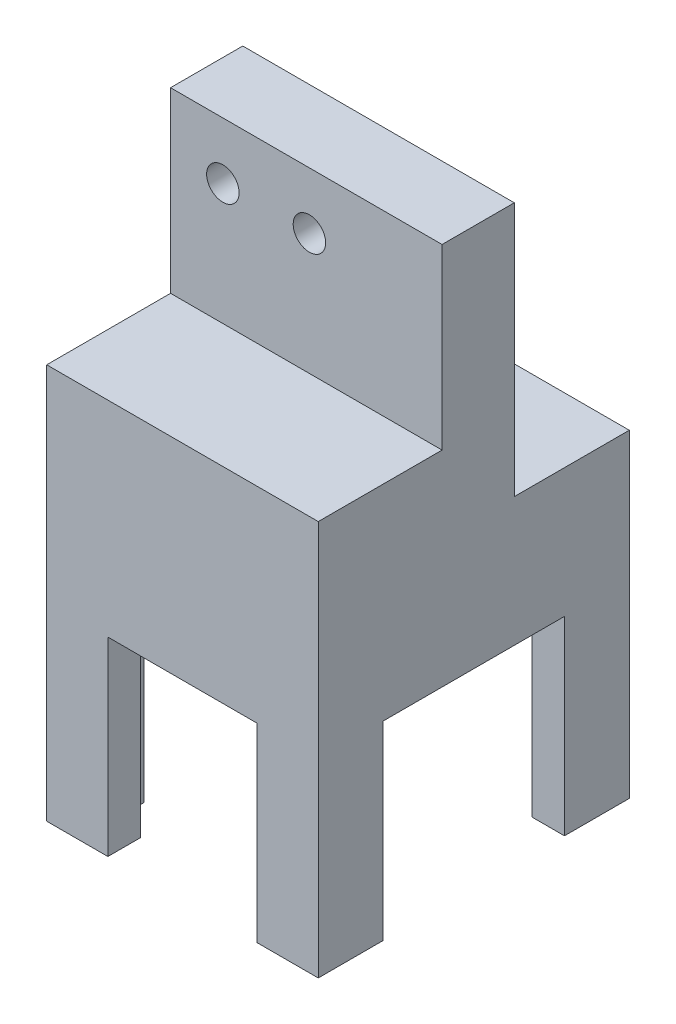
ISO-10303-21;
HEADER;
FILE_DESCRIPTION(('STEP AP214'),'2;1');
FILE_NAME('part.step','',(''),(''),'','','');
FILE_SCHEMA(('AUTOMOTIVE_DESIGN { 1 0 10303 214 1 1 1 1 }'));
ENDSEC;
DATA;
#1=APPLICATION_CONTEXT('core data for automotive mechanical design processes');
#2=APPLICATION_PROTOCOL_DEFINITION('international standard','automotive_design',2000,#1);
#3=PRODUCT_CONTEXT('',#1,'mechanical');
#4=PRODUCT('Part','Part','',(#3));
#5=PRODUCT_RELATED_PRODUCT_CATEGORY('part','',(#4));
#6=PRODUCT_DEFINITION_FORMATION('','',#4);
#7=PRODUCT_DEFINITION_CONTEXT('part definition',#1,'design');
#8=PRODUCT_DEFINITION('design','',#6,#7);
#9=PRODUCT_DEFINITION_SHAPE('','',#8);
#10=(LENGTH_UNIT() NAMED_UNIT(*) SI_UNIT(.MILLI.,.METRE.));
#11=(NAMED_UNIT(*) PLANE_ANGLE_UNIT() SI_UNIT($,.RADIAN.));
#12=(NAMED_UNIT(*) SI_UNIT($,.STERADIAN.) SOLID_ANGLE_UNIT());
#13=UNCERTAINTY_MEASURE_WITH_UNIT(LENGTH_MEASURE(1.E-05),#10,'distance_accuracy_value','');
#14=(GEOMETRIC_REPRESENTATION_CONTEXT(3) GLOBAL_UNCERTAINTY_ASSIGNED_CONTEXT((#13)) GLOBAL_UNIT_ASSIGNED_CONTEXT((#10,
#11,#12)) REPRESENTATION_CONTEXT('',''));
#15=CARTESIAN_POINT('',(0.,0.,0.));
#16=DIRECTION('',(0.,0.,1.));
#17=DIRECTION('',(1.,0.,0.));
#18=AXIS2_PLACEMENT_3D('',#15,#16,#17);
#19=CARTESIAN_POINT('',(0.,0.,0.));
#20=DIRECTION('',(0.,1.,0.));
#21=DIRECTION('',(0.,0.,1.));
#22=AXIS2_PLACEMENT_3D('',#19,#20,#21);
#23=PLANE('',#22);
#24=DIRECTION('',(-1.,0.,0.));
#25=VECTOR('',#24,1.);
#26=CARTESIAN_POINT('',(-12.55,0.,-14.375));
#27=LINE('',#26,#25);
#28=CARTESIAN_POINT('',(-6.89916134176453,0.,-14.375));
#29=VERTEX_POINT('',#28);
#30=CARTESIAN_POINT('',(-12.55,0.,-14.375));
#31=VERTEX_POINT('',#30);
#32=EDGE_CURVE('E543',#29,#31,#27,.T.);
#33=ORIENTED_EDGE('',*,*,#32,.F.);
#34=DIRECTION('',(0.,0.,1.));
#35=VECTOR('',#34,1.);
#36=CARTESIAN_POINT('',(-6.89916134176453,0.,0.));
#37=LINE('',#36,#35);
#38=CARTESIAN_POINT('',(-6.89916134176453,0.,-11.375));
#39=VERTEX_POINT('',#38);
#40=EDGE_CURVE('E385',#29,#39,#37,.T.);
#41=ORIENTED_EDGE('',*,*,#40,.T.);
#42=DIRECTION('',(1.,0.,0.));
#43=VECTOR('',#42,1.);
#44=CARTESIAN_POINT('',(-9.55,0.,-11.375));
#45=LINE('',#44,#43);
#46=CARTESIAN_POINT('',(-9.55,0.,-11.375));
#47=VERTEX_POINT('',#46);
#48=EDGE_CURVE('E492',#47,#39,#45,.T.);
#49=ORIENTED_EDGE('',*,*,#48,.F.);
#50=DIRECTION('',(0.,0.,-1.));
#51=VECTOR('',#50,1.);
#52=CARTESIAN_POINT('',(-9.55,0.,11.375));
#53=LINE('',#52,#51);
#54=CARTESIAN_POINT('',(-9.55,0.,-8.38477513407504));
#55=VERTEX_POINT('',#54);
#56=EDGE_CURVE('E506',#55,#47,#53,.T.);
#57=ORIENTED_EDGE('',*,*,#56,.F.);
#58=DIRECTION('',(-1.,0.,0.));
#59=VECTOR('',#58,1.);
#60=CARTESIAN_POINT('',(0.,0.,-8.38477513407504));
#61=LINE('',#60,#59);
#62=CARTESIAN_POINT('',(-12.55,0.,-8.38477513407504));
#63=VERTEX_POINT('',#62);
#64=EDGE_CURVE('E429',#55,#63,#61,.T.);
#65=ORIENTED_EDGE('',*,*,#64,.T.);
#66=DIRECTION('',(0.,0.,1.));
#67=VECTOR('',#66,1.);
#68=CARTESIAN_POINT('',(-12.55,0.,-14.375));
#69=LINE('',#68,#67);
#70=EDGE_CURVE('E549',#31,#63,#69,.T.);
#71=ORIENTED_EDGE('',*,*,#70,.F.);
#72=EDGE_LOOP('',(#33,#41,#49,#57,#65,#71));
#73=FACE_BOUND('',#72,.T.);
#74=ADVANCED_FACE('F45',(#73),#23,.F.);
#75=DIRECTION('',(-1.,0.,0.));
#76=VECTOR('',#75,1.);
#77=CARTESIAN_POINT('',(-9.55,0.,11.375));
#78=LINE('',#77,#76);
#79=CARTESIAN_POINT('',(-6.89916134176453,0.,11.375));
#80=VERTEX_POINT('',#79);
#81=CARTESIAN_POINT('',(-9.55,0.,11.375));
#82=VERTEX_POINT('',#81);
#83=EDGE_CURVE('E501',#80,#82,#78,.T.);
#84=ORIENTED_EDGE('',*,*,#83,.F.);
#85=DIRECTION('',(0.,0.,1.));
#86=VECTOR('',#85,1.);
#87=CARTESIAN_POINT('',(-6.89916134176453,0.,0.));
#88=LINE('',#87,#86);
#89=CARTESIAN_POINT('',(-6.89916134176453,0.,14.375));
#90=VERTEX_POINT('',#89);
#91=EDGE_CURVE('E373',#80,#90,#88,.T.);
#92=ORIENTED_EDGE('',*,*,#91,.T.);
#93=DIRECTION('',(1.,0.,0.));
#94=VECTOR('',#93,1.);
#95=CARTESIAN_POINT('',(-12.55,0.,14.375));
#96=LINE('',#95,#94);
#97=CARTESIAN_POINT('',(-12.55,0.,14.375));
#98=VERTEX_POINT('',#97);
#99=EDGE_CURVE('E534',#98,#90,#96,.T.);
#100=ORIENTED_EDGE('',*,*,#99,.F.);
#101=CARTESIAN_POINT('',(-12.55,0.,8.38477513407504));
#102=VERTEX_POINT('',#101);
#103=EDGE_CURVE('E548',#102,#98,#69,.T.);
#104=ORIENTED_EDGE('',*,*,#103,.F.);
#105=DIRECTION('',(1.,0.,0.));
#106=VECTOR('',#105,1.);
#107=CARTESIAN_POINT('',(0.,0.,8.38477513407504));
#108=LINE('',#107,#106);
#109=CARTESIAN_POINT('',(-9.55,0.,8.38477513407504));
#110=VERTEX_POINT('',#109);
#111=EDGE_CURVE('E416',#102,#110,#108,.T.);
#112=ORIENTED_EDGE('',*,*,#111,.T.);
#113=EDGE_CURVE('E507',#82,#110,#53,.T.);
#114=ORIENTED_EDGE('',*,*,#113,.F.);
#115=EDGE_LOOP('',(#84,#92,#100,#104,#112,#114));
#116=FACE_BOUND('',#115,.T.);
#117=ADVANCED_FACE('F696',(#116),#23,.F.);
#118=CARTESIAN_POINT('',(-9.55,21.67,-11.375));
#119=DIRECTION('',(0.,0.,-1.));
#120=DIRECTION('',(-1.,0.,0.));
#121=AXIS2_PLACEMENT_3D('',#118,#119,#120);
#122=PLANE('',#121);
#123=ORIENTED_EDGE('',*,*,#48,.T.);
#124=DIRECTION('',(0.,1.,0.));
#125=VECTOR('',#124,1.);
#126=CARTESIAN_POINT('',(-6.89916134176453,21.67,-11.375));
#127=LINE('',#126,#125);
#128=CARTESIAN_POINT('',(-6.89916134176453,17.57,-11.375));
#129=VERTEX_POINT('',#128);
#130=EDGE_CURVE('E381',#39,#129,#127,.T.);
#131=ORIENTED_EDGE('',*,*,#130,.T.);
#132=DIRECTION('',(1.,0.,0.));
#133=VECTOR('',#132,1.);
#134=CARTESIAN_POINT('',(-9.55,17.57,-11.375));
#135=LINE('',#134,#133);
#136=CARTESIAN_POINT('',(-9.55,17.57,-11.375));
#137=VERTEX_POINT('',#136);
#138=EDGE_CURVE('E582',#129,#137,#135,.F.);
#139=ORIENTED_EDGE('',*,*,#138,.T.);
#140=DIRECTION('',(0.,-1.,0.));
#141=VECTOR('',#140,1.);
#142=CARTESIAN_POINT('',(-9.55,21.67,-11.375));
#143=LINE('',#142,#141);
#144=EDGE_CURVE('E520',#137,#47,#143,.T.);
#145=ORIENTED_EDGE('',*,*,#144,.T.);
#146=EDGE_LOOP('',(#123,#131,#139,#145));
#147=FACE_BOUND('',#146,.T.);
#148=ADVANCED_FACE('F754',(#147),#122,.F.);
#149=CARTESIAN_POINT('',(-9.55,21.67,11.375));
#150=DIRECTION('',(0.,0.,1.));
#151=DIRECTION('',(1.,0.,0.));
#152=AXIS2_PLACEMENT_3D('',#149,#150,#151);
#153=PLANE('',#152);
#154=DIRECTION('',(-1.,0.,0.));
#155=VECTOR('',#154,1.);
#156=CARTESIAN_POINT('',(-9.55,17.57,11.375));
#157=LINE('',#156,#155);
#158=CARTESIAN_POINT('',(-9.55,17.57,11.375));
#159=VERTEX_POINT('',#158);
#160=CARTESIAN_POINT('',(-6.89916134176453,17.57,11.375));
#161=VERTEX_POINT('',#160);
#162=EDGE_CURVE('E594',#159,#161,#157,.F.);
#163=ORIENTED_EDGE('',*,*,#162,.T.);
#164=DIRECTION('',(0.,-1.,0.));
#165=VECTOR('',#164,1.);
#166=CARTESIAN_POINT('',(-6.89916134176453,21.67,11.375));
#167=LINE('',#166,#165);
#168=EDGE_CURVE('E369',#161,#80,#167,.T.);
#169=ORIENTED_EDGE('',*,*,#168,.T.);
#170=ORIENTED_EDGE('',*,*,#83,.T.);
#171=DIRECTION('',(0.,-1.,0.));
#172=VECTOR('',#171,1.);
#173=CARTESIAN_POINT('',(-9.55,21.67,11.375));
#174=LINE('',#173,#172);
#175=EDGE_CURVE('E524',#159,#82,#174,.T.);
#176=ORIENTED_EDGE('',*,*,#175,.F.);
#177=EDGE_LOOP('',(#163,#169,#170,#176));
#178=FACE_BOUND('',#177,.T.);
#179=ADVANCED_FACE('F692',(#178),#153,.F.);
#180=CARTESIAN_POINT('',(6.89916134176454,0.,-11.375));
#181=VERTEX_POINT('',#180);
#182=CARTESIAN_POINT('',(9.55,0.,-11.375));
#183=VERTEX_POINT('',#182);
#184=EDGE_CURVE('E511',#181,#183,#45,.T.);
#185=ORIENTED_EDGE('',*,*,#184,.F.);
#186=DIRECTION('',(0.,0.,-1.));
#187=VECTOR('',#186,1.);
#188=CARTESIAN_POINT('',(6.89916134176454,0.,0.));
#189=LINE('',#188,#187);
#190=CARTESIAN_POINT('',(6.89916134176454,0.,-14.375));
#191=VERTEX_POINT('',#190);
#192=EDGE_CURVE('E365',#181,#191,#189,.T.);
#193=ORIENTED_EDGE('',*,*,#192,.T.);
#194=CARTESIAN_POINT('',(12.55,0.,-14.375));
#195=VERTEX_POINT('',#194);
#196=EDGE_CURVE('E544',#195,#191,#27,.T.);
#197=ORIENTED_EDGE('',*,*,#196,.F.);
#198=DIRECTION('',(0.,0.,-1.));
#199=VECTOR('',#198,1.);
#200=CARTESIAN_POINT('',(12.55,0.,-14.375));
#201=LINE('',#200,#199);
#202=CARTESIAN_POINT('',(12.55,0.,-8.38477513407505));
#203=VERTEX_POINT('',#202);
#204=EDGE_CURVE('E519',#203,#195,#201,.T.);
#205=ORIENTED_EDGE('',*,*,#204,.F.);
#206=CARTESIAN_POINT('',(9.55,0.,-8.38477513407505));
#207=VERTEX_POINT('',#206);
#208=EDGE_CURVE('E434',#203,#207,#61,.T.);
#209=ORIENTED_EDGE('',*,*,#208,.T.);
#210=DIRECTION('',(0.,0.,1.));
#211=VECTOR('',#210,1.);
#212=CARTESIAN_POINT('',(9.55,0.,11.375));
#213=LINE('',#212,#211);
#214=EDGE_CURVE('E497',#183,#207,#213,.T.);
#215=ORIENTED_EDGE('',*,*,#214,.F.);
#216=EDGE_LOOP('',(#185,#193,#197,#205,#209,#215));
#217=FACE_BOUND('',#216,.T.);
#218=ADVANCED_FACE('F760',(#217),#23,.F.);
#219=CARTESIAN_POINT('',(12.55,53.,-14.375));
#220=DIRECTION('',(-1.,0.,0.));
#221=DIRECTION('',(0.,0.,1.));
#222=AXIS2_PLACEMENT_3D('',#219,#220,#221);
#223=PLANE('',#222);
#224=DIRECTION('',(0.,0.,-1.));
#225=VECTOR('',#224,1.);
#226=CARTESIAN_POINT('',(12.55,53.,-14.375));
#227=LINE('',#226,#225);
#228=CARTESIAN_POINT('',(12.55,53.,2.9301612));
#229=VERTEX_POINT('',#228);
#230=CARTESIAN_POINT('',(12.55,53.,-3.74571229406934));
#231=VERTEX_POINT('',#230);
#232=EDGE_CURVE('E294',#229,#231,#227,.T.);
#233=ORIENTED_EDGE('',*,*,#232,.F.);
#234=DIRECTION('',(0.,1.,0.));
#235=VECTOR('',#234,1.);
#236=CARTESIAN_POINT('',(12.55,36.54,2.9301612));
#237=LINE('',#236,#235);
#238=CARTESIAN_POINT('',(12.55,36.54,2.9301612));
#239=VERTEX_POINT('',#238);
#240=EDGE_CURVE('E284',#239,#229,#237,.T.);
#241=ORIENTED_EDGE('',*,*,#240,.F.);
#242=DIRECTION('',(0.,0.,1.));
#243=VECTOR('',#242,1.);
#244=CARTESIAN_POINT('',(12.55,36.54,-14.375));
#245=LINE('',#244,#243);
#246=CARTESIAN_POINT('',(12.55,36.54,14.375));
#247=VERTEX_POINT('',#246);
#248=EDGE_CURVE('E269',#239,#247,#245,.T.);
#249=ORIENTED_EDGE('',*,*,#248,.T.);
#250=DIRECTION('',(0.,-1.,0.));
#251=VECTOR('',#250,1.);
#252=CARTESIAN_POINT('',(12.55,53.,14.375));
#253=LINE('',#252,#251);
#254=CARTESIAN_POINT('',(12.55,0.,14.375));
#255=VERTEX_POINT('',#254);
#256=EDGE_CURVE('E538',#247,#255,#253,.T.);
#257=ORIENTED_EDGE('',*,*,#256,.T.);
#258=CARTESIAN_POINT('',(12.55,0.,8.38477513407503));
#259=VERTEX_POINT('',#258);
#260=EDGE_CURVE('E539',#255,#259,#201,.T.);
#261=ORIENTED_EDGE('',*,*,#260,.T.);
#262=DIRECTION('',(0.,-1.,0.));
#263=VECTOR('',#262,1.);
#264=CARTESIAN_POINT('',(12.55,-17.57,8.38477513407503));
#265=LINE('',#264,#263);
#266=CARTESIAN_POINT('',(12.55,17.57,8.38477513407503));
#267=VERTEX_POINT('',#266);
#268=EDGE_CURVE('E396',#267,#259,#265,.T.);
#269=ORIENTED_EDGE('',*,*,#268,.F.);
#270=DIRECTION('',(0.,0.,1.));
#271=VECTOR('',#270,1.);
#272=CARTESIAN_POINT('',(12.55,17.57,8.38477513407503));
#273=LINE('',#272,#271);
#274=CARTESIAN_POINT('',(12.55,17.57,-8.38477513407505));
#275=VERTEX_POINT('',#274);
#276=EDGE_CURVE('E392',#275,#267,#273,.T.);
#277=ORIENTED_EDGE('',*,*,#276,.F.);
#278=DIRECTION('',(0.,1.,0.));
#279=VECTOR('',#278,1.);
#280=CARTESIAN_POINT('',(12.55,-17.57,-8.38477513407505));
#281=LINE('',#280,#279);
#282=EDGE_CURVE('E389',#203,#275,#281,.T.);
#283=ORIENTED_EDGE('',*,*,#282,.F.);
#284=ORIENTED_EDGE('',*,*,#204,.T.);
#285=DIRECTION('',(0.,-1.,0.));
#286=VECTOR('',#285,1.);
#287=CARTESIAN_POINT('',(12.55,53.,-14.375));
#288=LINE('',#287,#286);
#289=CARTESIAN_POINT('',(12.55,29.4765035193945,-14.375));
#290=VERTEX_POINT('',#289);
#291=EDGE_CURVE('E565',#290,#195,#288,.T.);
#292=ORIENTED_EDGE('',*,*,#291,.F.);
#293=DIRECTION('',(0.,0.,1.));
#294=VECTOR('',#293,1.);
#295=CARTESIAN_POINT('',(12.55,29.4765035193945,-14.375));
#296=LINE('',#295,#294);
#297=CARTESIAN_POINT('',(12.55,29.4765035193945,-3.74571229406934));
#298=VERTEX_POINT('',#297);
#299=EDGE_CURVE('E316',#290,#298,#296,.T.);
#300=ORIENTED_EDGE('',*,*,#299,.T.);
#301=DIRECTION('',(0.,1.,0.));
#302=VECTOR('',#301,1.);
#303=CARTESIAN_POINT('',(12.55,53.,-3.74571229406934));
#304=LINE('',#303,#302);
#305=EDGE_CURVE('E311',#298,#231,#304,.T.);
#306=ORIENTED_EDGE('',*,*,#305,.T.);
#307=EDGE_LOOP('',(#233,#241,#249,#257,#261,#269,#277,#283,#284,#292,#300,#306));
#308=FACE_BOUND('',#307,.T.);
#309=ADVANCED_FACE('F292',(#308),#223,.F.);
#310=CARTESIAN_POINT('',(-12.55,53.,-14.375));
#311=DIRECTION('',(0.,0.,1.));
#312=DIRECTION('',(1.,0.,0.));
#313=AXIS2_PLACEMENT_3D('',#310,#311,#312);
#314=PLANE('',#313);
#315=DIRECTION('',(0.,-1.,0.));
#316=VECTOR('',#315,1.);
#317=CARTESIAN_POINT('',(-12.55,53.,-14.375));
#318=LINE('',#317,#316);
#319=CARTESIAN_POINT('',(-12.55,29.4765035193945,-14.375));
#320=VERTEX_POINT('',#319);
#321=EDGE_CURVE('E562',#320,#31,#318,.T.);
#322=ORIENTED_EDGE('',*,*,#321,.F.);
#323=DIRECTION('',(-1.,0.,0.));
#324=VECTOR('',#323,1.);
#325=CARTESIAN_POINT('',(27.45,29.4765035193945,-14.375));
#326=LINE('',#325,#324);
#327=EDGE_CURVE('E307',#290,#320,#326,.T.);
#328=ORIENTED_EDGE('',*,*,#327,.F.);
#329=ORIENTED_EDGE('',*,*,#291,.T.);
#330=ORIENTED_EDGE('',*,*,#196,.T.);
#331=DIRECTION('',(0.,-1.,0.));
#332=VECTOR('',#331,1.);
#333=CARTESIAN_POINT('',(6.89916134176454,-17.57,-14.375));
#334=LINE('',#333,#332);
#335=CARTESIAN_POINT('',(6.89916134176454,17.57,-14.375));
#336=VERTEX_POINT('',#335);
#337=EDGE_CURVE('E330',#336,#191,#334,.T.);
#338=ORIENTED_EDGE('',*,*,#337,.F.);
#339=DIRECTION('',(1.,0.,0.));
#340=VECTOR('',#339,1.);
#341=CARTESIAN_POINT('',(6.89916134176454,17.57,-14.375));
#342=LINE('',#341,#340);
#343=CARTESIAN_POINT('',(-6.89916134176453,17.57,-14.375));
#344=VERTEX_POINT('',#343);
#345=EDGE_CURVE('E327',#344,#336,#342,.T.);
#346=ORIENTED_EDGE('',*,*,#345,.F.);
#347=DIRECTION('',(0.,1.,0.));
#348=VECTOR('',#347,1.);
#349=CARTESIAN_POINT('',(-6.89916134176453,-17.57,-14.375));
#350=LINE('',#349,#348);
#351=EDGE_CURVE('E279',#29,#344,#350,.T.);
#352=ORIENTED_EDGE('',*,*,#351,.F.);
#353=ORIENTED_EDGE('',*,*,#32,.T.);
#354=EDGE_LOOP('',(#322,#328,#329,#330,#338,#346,#352,#353));
#355=FACE_BOUND('',#354,.T.);
#356=ADVANCED_FACE('F650',(#355),#314,.F.);
#357=CARTESIAN_POINT('',(-12.55,53.,-14.375));
#358=DIRECTION('',(1.,0.,0.));
#359=DIRECTION('',(0.,0.,-1.));
#360=AXIS2_PLACEMENT_3D('',#357,#358,#359);
#361=PLANE('',#360);
#362=DIRECTION('',(0.,0.,1.));
#363=VECTOR('',#362,1.);
#364=CARTESIAN_POINT('',(-12.55,36.54,5.875));
#365=LINE('',#364,#363);
#366=CARTESIAN_POINT('',(-12.55,36.54,2.9301612));
#367=VERTEX_POINT('',#366);
#368=CARTESIAN_POINT('',(-12.55,36.54,14.375));
#369=VERTEX_POINT('',#368);
#370=EDGE_CURVE('E320',#367,#369,#365,.T.);
#371=ORIENTED_EDGE('',*,*,#370,.F.);
#372=DIRECTION('',(0.,1.,0.));
#373=VECTOR('',#372,1.);
#374=CARTESIAN_POINT('',(-12.55,36.54,2.9301612));
#375=LINE('',#374,#373);
#376=CARTESIAN_POINT('',(-12.55,53.,2.9301612));
#377=VERTEX_POINT('',#376);
#378=EDGE_CURVE('E287',#367,#377,#375,.T.);
#379=ORIENTED_EDGE('',*,*,#378,.T.);
#380=DIRECTION('',(0.,0.,1.));
#381=VECTOR('',#380,1.);
#382=CARTESIAN_POINT('',(-12.55,53.,-14.375));
#383=LINE('',#382,#381);
#384=CARTESIAN_POINT('',(-12.55,53.,-3.74571229406933));
#385=VERTEX_POINT('',#384);
#386=EDGE_CURVE('E533',#385,#377,#383,.T.);
#387=ORIENTED_EDGE('',*,*,#386,.F.);
#388=DIRECTION('',(0.,1.,0.));
#389=VECTOR('',#388,1.);
#390=CARTESIAN_POINT('',(-12.55,53.,-3.74571229406933));
#391=LINE('',#390,#389);
#392=CARTESIAN_POINT('',(-12.55,29.4765035193945,-3.74571229406933));
#393=VERTEX_POINT('',#392);
#394=EDGE_CURVE('E62',#393,#385,#391,.T.);
#395=ORIENTED_EDGE('',*,*,#394,.F.);
#396=DIRECTION('',(0.,0.,1.));
#397=VECTOR('',#396,1.);
#398=CARTESIAN_POINT('',(-12.55,29.4765035193945,-14.375));
#399=LINE('',#398,#397);
#400=EDGE_CURVE('E298',#320,#393,#399,.T.);
#401=ORIENTED_EDGE('',*,*,#400,.F.);
#402=ORIENTED_EDGE('',*,*,#321,.T.);
#403=ORIENTED_EDGE('',*,*,#70,.T.);
#404=DIRECTION('',(0.,1.,0.));
#405=VECTOR('',#404,1.);
#406=CARTESIAN_POINT('',(-12.55,53.,-8.38477513407504));
#407=LINE('',#406,#405);
#408=CARTESIAN_POINT('',(-12.55,17.57,-8.38477513407504));
#409=VERTEX_POINT('',#408);
#410=EDGE_CURVE('E433',#63,#409,#407,.T.);
#411=ORIENTED_EDGE('',*,*,#410,.T.);
#412=DIRECTION('',(0.,0.,1.));
#413=VECTOR('',#412,1.);
#414=CARTESIAN_POINT('',(-12.55,17.57,-14.375));
#415=LINE('',#414,#413);
#416=CARTESIAN_POINT('',(-12.55,17.57,8.38477513407504));
#417=VERTEX_POINT('',#416);
#418=EDGE_CURVE('E412',#409,#417,#415,.T.);
#419=ORIENTED_EDGE('',*,*,#418,.T.);
#420=DIRECTION('',(0.,-1.,0.));
#421=VECTOR('',#420,1.);
#422=CARTESIAN_POINT('',(-12.55,53.,8.38477513407504));
#423=LINE('',#422,#421);
#424=EDGE_CURVE('E420',#417,#102,#423,.T.);
#425=ORIENTED_EDGE('',*,*,#424,.T.);
#426=ORIENTED_EDGE('',*,*,#103,.T.);
#427=DIRECTION('',(0.,-1.,0.));
#428=VECTOR('',#427,1.);
#429=CARTESIAN_POINT('',(-12.55,53.,14.375));
#430=LINE('',#429,#428);
#431=EDGE_CURVE('E559',#369,#98,#430,.T.);
#432=ORIENTED_EDGE('',*,*,#431,.F.);
#433=EDGE_LOOP('',(#371,#379,#387,#395,#401,#402,#403,#411,#419,#425,#426,#432));
#434=FACE_BOUND('',#433,.T.);
#435=ADVANCED_FACE('F644',(#434),#361,.F.);
#436=CARTESIAN_POINT('',(-12.55,53.,14.375));
#437=DIRECTION('',(0.,0.,-1.));
#438=DIRECTION('',(-1.,0.,0.));
#439=AXIS2_PLACEMENT_3D('',#436,#437,#438);
#440=PLANE('',#439);
#441=ORIENTED_EDGE('',*,*,#256,.F.);
#442=DIRECTION('',(-1.,0.,0.));
#443=VECTOR('',#442,1.);
#444=CARTESIAN_POINT('',(27.45,36.54,14.375));
#445=LINE('',#444,#443);
#446=EDGE_CURVE('E274',#247,#369,#445,.T.);
#447=ORIENTED_EDGE('',*,*,#446,.T.);
#448=ORIENTED_EDGE('',*,*,#431,.T.);
#449=ORIENTED_EDGE('',*,*,#99,.T.);
#450=DIRECTION('',(0.,1.,0.));
#451=VECTOR('',#450,1.);
#452=CARTESIAN_POINT('',(-6.89916134176453,53.,14.375));
#453=LINE('',#452,#451);
#454=CARTESIAN_POINT('',(-6.89916134176453,17.57,14.375));
#455=VERTEX_POINT('',#454);
#456=EDGE_CURVE('E377',#90,#455,#453,.T.);
#457=ORIENTED_EDGE('',*,*,#456,.T.);
#458=DIRECTION('',(1.,0.,0.));
#459=VECTOR('',#458,1.);
#460=CARTESIAN_POINT('',(-12.55,17.57,14.375));
#461=LINE('',#460,#459);
#462=CARTESIAN_POINT('',(6.89916134176454,17.57,14.375));
#463=VERTEX_POINT('',#462);
#464=EDGE_CURVE('E345',#455,#463,#461,.T.);
#465=ORIENTED_EDGE('',*,*,#464,.T.);
#466=DIRECTION('',(0.,-1.,0.));
#467=VECTOR('',#466,1.);
#468=CARTESIAN_POINT('',(6.89916134176453,53.,14.375));
#469=LINE('',#468,#467);
#470=CARTESIAN_POINT('',(6.89916134176454,0.,14.375));
#471=VERTEX_POINT('',#470);
#472=EDGE_CURVE('E357',#463,#471,#469,.T.);
#473=ORIENTED_EDGE('',*,*,#472,.T.);
#474=EDGE_CURVE('E553',#471,#255,#96,.T.);
#475=ORIENTED_EDGE('',*,*,#474,.T.);
#476=EDGE_LOOP('',(#441,#447,#448,#449,#457,#465,#473,#475));
#477=FACE_BOUND('',#476,.T.);
#478=ADVANCED_FACE('F703',(#477),#440,.F.);
#479=CARTESIAN_POINT('',(0.,53.,0.));
#480=DIRECTION('',(0.,1.,0.));
#481=DIRECTION('',(0.,0.,1.));
#482=AXIS2_PLACEMENT_3D('',#479,#480,#481);
#483=PLANE('',#482);
#484=DIRECTION('',(-1.,0.,0.));
#485=VECTOR('',#484,1.);
#486=CARTESIAN_POINT('',(-12.55,53.,2.9301612));
#487=LINE('',#486,#485);
#488=EDGE_CURVE('E289',#229,#377,#487,.T.);
#489=ORIENTED_EDGE('',*,*,#488,.F.);
#490=ORIENTED_EDGE('',*,*,#232,.T.);
#491=DIRECTION('',(1.,0.,0.));
#492=VECTOR('',#491,1.);
#493=CARTESIAN_POINT('',(0.,53.,-3.74571229406934));
#494=LINE('',#493,#492);
#495=EDGE_CURVE('E11',#385,#231,#494,.T.);
#496=ORIENTED_EDGE('',*,*,#495,.F.);
#497=ORIENTED_EDGE('',*,*,#386,.T.);
#498=EDGE_LOOP('',(#489,#490,#496,#497));
#499=FACE_BOUND('',#498,.T.);
#500=ADVANCED_FACE('F646',(#499),#483,.T.);
#501=ORIENTED_EDGE('',*,*,#474,.F.);
#502=DIRECTION('',(0.,0.,-1.));
#503=VECTOR('',#502,1.);
#504=CARTESIAN_POINT('',(6.89916134176454,0.,0.));
#505=LINE('',#504,#503);
#506=CARTESIAN_POINT('',(6.89916134176454,0.,11.375));
#507=VERTEX_POINT('',#506);
#508=EDGE_CURVE('E353',#471,#507,#505,.T.);
#509=ORIENTED_EDGE('',*,*,#508,.T.);
#510=CARTESIAN_POINT('',(9.55,0.,11.375));
#511=VERTEX_POINT('',#510);
#512=EDGE_CURVE('E502',#511,#507,#78,.T.);
#513=ORIENTED_EDGE('',*,*,#512,.F.);
#514=CARTESIAN_POINT('',(9.55,0.,8.38477513407504));
#515=VERTEX_POINT('',#514);
#516=EDGE_CURVE('E477',#515,#511,#213,.T.);
#517=ORIENTED_EDGE('',*,*,#516,.F.);
#518=EDGE_CURVE('E421',#515,#259,#108,.T.);
#519=ORIENTED_EDGE('',*,*,#518,.T.);
#520=ORIENTED_EDGE('',*,*,#260,.F.);
#521=EDGE_LOOP('',(#501,#509,#513,#517,#519,#520));
#522=FACE_BOUND('',#521,.T.);
#523=ADVANCED_FACE('F711',(#522),#23,.F.);
#524=CARTESIAN_POINT('',(9.55,21.67,11.375));
#525=DIRECTION('',(1.,0.,0.));
#526=DIRECTION('',(0.,0.,-1.));
#527=AXIS2_PLACEMENT_3D('',#524,#525,#526);
#528=PLANE('',#527);
#529=ORIENTED_EDGE('',*,*,#214,.T.);
#530=DIRECTION('',(0.,1.,0.));
#531=VECTOR('',#530,1.);
#532=CARTESIAN_POINT('',(9.55,21.67,-8.38477513407505));
#533=LINE('',#532,#531);
#534=CARTESIAN_POINT('',(9.55,17.57,-8.38477513407504));
#535=VERTEX_POINT('',#534);
#536=EDGE_CURVE('E438',#207,#535,#533,.T.);
#537=ORIENTED_EDGE('',*,*,#536,.T.);
#538=DIRECTION('',(0.,0.,1.));
#539=VECTOR('',#538,1.);
#540=CARTESIAN_POINT('',(9.55,17.57,11.375));
#541=LINE('',#540,#539);
#542=CARTESIAN_POINT('',(9.55,17.57,8.38477513407505));
#543=VERTEX_POINT('',#542);
#544=EDGE_CURVE('E408',#535,#543,#541,.T.);
#545=ORIENTED_EDGE('',*,*,#544,.T.);
#546=DIRECTION('',(0.,-1.,0.));
#547=VECTOR('',#546,1.);
#548=CARTESIAN_POINT('',(9.55,21.67,8.38477513407504));
#549=LINE('',#548,#547);
#550=EDGE_CURVE('E425',#543,#515,#549,.T.);
#551=ORIENTED_EDGE('',*,*,#550,.T.);
#552=ORIENTED_EDGE('',*,*,#516,.T.);
#553=DIRECTION('',(0.,-1.,0.));
#554=VECTOR('',#553,1.);
#555=CARTESIAN_POINT('',(9.55,21.67,11.375));
#556=LINE('',#555,#554);
#557=CARTESIAN_POINT('',(9.55,17.57,11.375));
#558=VERTEX_POINT('',#557);
#559=EDGE_CURVE('E496',#558,#511,#556,.T.);
#560=ORIENTED_EDGE('',*,*,#559,.F.);
#561=CARTESIAN_POINT('',(9.55,17.57,7.275));
#562=DIRECTION('',(1.,0.,0.));
#563=DIRECTION('',(0.,0.,-1.));
#564=AXIS2_PLACEMENT_3D('',#561,#562,#563);
#565=CIRCLE('',#564,4.1);
#566=CARTESIAN_POINT('',(9.55,21.67,7.275));
#567=VERTEX_POINT('',#566);
#568=EDGE_CURVE('E576',#558,#567,#565,.F.);
#569=ORIENTED_EDGE('',*,*,#568,.T.);
#570=DIRECTION('',(0.,0.,1.));
#571=VECTOR('',#570,1.);
#572=CARTESIAN_POINT('',(9.55,21.67,11.375));
#573=LINE('',#572,#571);
#574=CARTESIAN_POINT('',(9.55,21.67,-7.275));
#575=VERTEX_POINT('',#574);
#576=EDGE_CURVE('E487',#575,#567,#573,.T.);
#577=ORIENTED_EDGE('',*,*,#576,.F.);
#578=CARTESIAN_POINT('',(9.55,17.57,-7.275));
#579=DIRECTION('',(1.,0.,0.));
#580=DIRECTION('',(0.,0.,-1.));
#581=AXIS2_PLACEMENT_3D('',#578,#579,#580);
#582=CIRCLE('',#581,4.1);
#583=CARTESIAN_POINT('',(9.55,17.57,-11.375));
#584=VERTEX_POINT('',#583);
#585=EDGE_CURVE('E579',#575,#584,#582,.F.);
#586=ORIENTED_EDGE('',*,*,#585,.T.);
#587=DIRECTION('',(0.,-1.,0.));
#588=VECTOR('',#587,1.);
#589=CARTESIAN_POINT('',(9.55,21.67,-11.375));
#590=LINE('',#589,#588);
#591=EDGE_CURVE('E515',#584,#183,#590,.T.);
#592=ORIENTED_EDGE('',*,*,#591,.T.);
#593=EDGE_LOOP('',(#529,#537,#545,#551,#552,#560,#569,#577,#586,#592));
#594=FACE_BOUND('',#593,.T.);
#595=ADVANCED_FACE('F732',(#594),#528,.F.);
#596=CARTESIAN_POINT('',(6.89916134176454,17.57,-11.375));
#597=VERTEX_POINT('',#596);
#598=EDGE_CURVE('E583',#584,#597,#135,.F.);
#599=ORIENTED_EDGE('',*,*,#598,.T.);
#600=DIRECTION('',(0.,-1.,0.));
#601=VECTOR('',#600,1.);
#602=CARTESIAN_POINT('',(6.89916134176454,21.67,-11.375));
#603=LINE('',#602,#601);
#604=EDGE_CURVE('E361',#597,#181,#603,.T.);
#605=ORIENTED_EDGE('',*,*,#604,.T.);
#606=ORIENTED_EDGE('',*,*,#184,.T.);
#607=ORIENTED_EDGE('',*,*,#591,.F.);
#608=EDGE_LOOP('',(#599,#605,#606,#607));
#609=FACE_BOUND('',#608,.T.);
#610=ADVANCED_FACE('F746',(#609),#122,.F.);
#611=CARTESIAN_POINT('',(-9.55,21.67,11.375));
#612=DIRECTION('',(-1.,0.,0.));
#613=DIRECTION('',(0.,0.,1.));
#614=AXIS2_PLACEMENT_3D('',#611,#612,#613);
#615=PLANE('',#614);
#616=DIRECTION('',(0.,0.,-1.));
#617=VECTOR('',#616,1.);
#618=CARTESIAN_POINT('',(-9.55,17.57,11.375));
#619=LINE('',#618,#617);
#620=CARTESIAN_POINT('',(-9.55,17.57,8.38477513407504));
#621=VERTEX_POINT('',#620);
#622=CARTESIAN_POINT('',(-9.55,17.57,-8.38477513407504));
#623=VERTEX_POINT('',#622);
#624=EDGE_CURVE('E598',#621,#623,#619,.T.);
#625=ORIENTED_EDGE('',*,*,#624,.T.);
#626=DIRECTION('',(0.,-1.,0.));
#627=VECTOR('',#626,1.);
#628=CARTESIAN_POINT('',(-9.55,21.67,-8.38477513407504));
#629=LINE('',#628,#627);
#630=EDGE_CURVE('E55',#623,#55,#629,.T.);
#631=ORIENTED_EDGE('',*,*,#630,.T.);
#632=ORIENTED_EDGE('',*,*,#56,.T.);
#633=ORIENTED_EDGE('',*,*,#144,.F.);
#634=CARTESIAN_POINT('',(-9.55,17.57,-7.275));
#635=DIRECTION('',(-1.,0.,0.));
#636=DIRECTION('',(0.,0.,1.));
#637=AXIS2_PLACEMENT_3D('',#634,#635,#636);
#638=CIRCLE('',#637,4.1);
#639=CARTESIAN_POINT('',(-9.55,21.67,-7.275));
#640=VERTEX_POINT('',#639);
#641=EDGE_CURVE('E590',#137,#640,#638,.F.);
#642=ORIENTED_EDGE('',*,*,#641,.T.);
#643=DIRECTION('',(0.,0.,-1.));
#644=VECTOR('',#643,1.);
#645=CARTESIAN_POINT('',(-9.55,21.67,11.375));
#646=LINE('',#645,#644);
#647=CARTESIAN_POINT('',(-9.55,21.67,7.275));
#648=VERTEX_POINT('',#647);
#649=EDGE_CURVE('E491',#648,#640,#646,.T.);
#650=ORIENTED_EDGE('',*,*,#649,.F.);
#651=CARTESIAN_POINT('',(-9.55,17.57,7.275));
#652=DIRECTION('',(-1.,0.,0.));
#653=DIRECTION('',(0.,0.,1.));
#654=AXIS2_PLACEMENT_3D('',#651,#652,#653);
#655=CIRCLE('',#654,4.1);
#656=EDGE_CURVE('E587',#648,#159,#655,.F.);
#657=ORIENTED_EDGE('',*,*,#656,.T.);
#658=ORIENTED_EDGE('',*,*,#175,.T.);
#659=ORIENTED_EDGE('',*,*,#113,.T.);
#660=DIRECTION('',(0.,1.,0.));
#661=VECTOR('',#660,1.);
#662=CARTESIAN_POINT('',(-9.55,21.67,8.38477513407504));
#663=LINE('',#662,#661);
#664=EDGE_CURVE('E603',#110,#621,#663,.T.);
#665=ORIENTED_EDGE('',*,*,#664,.T.);
#666=EDGE_LOOP('',(#625,#631,#632,#633,#642,#650,#657,#658,#659,#665));
#667=FACE_BOUND('',#666,.T.);
#668=ADVANCED_FACE('F663',(#667),#615,.F.);
#669=ORIENTED_EDGE('',*,*,#512,.T.);
#670=DIRECTION('',(0.,1.,0.));
#671=VECTOR('',#670,1.);
#672=CARTESIAN_POINT('',(6.89916134176454,21.67,11.375));
#673=LINE('',#672,#671);
#674=CARTESIAN_POINT('',(6.89916134176454,17.57,11.375));
#675=VERTEX_POINT('',#674);
#676=EDGE_CURVE('E349',#507,#675,#673,.T.);
#677=ORIENTED_EDGE('',*,*,#676,.T.);
#678=EDGE_CURVE('E593',#675,#558,#157,.F.);
#679=ORIENTED_EDGE('',*,*,#678,.T.);
#680=ORIENTED_EDGE('',*,*,#559,.T.);
#681=EDGE_LOOP('',(#669,#677,#679,#680));
#682=FACE_BOUND('',#681,.T.);
#683=ADVANCED_FACE('F730',(#682),#153,.F.);
#684=CARTESIAN_POINT('',(0.,21.67,0.));
#685=DIRECTION('',(0.,-1.,0.));
#686=DIRECTION('',(0.,0.,-1.));
#687=AXIS2_PLACEMENT_3D('',#684,#685,#686);
#688=PLANE('',#687);
#689=DIRECTION('',(0.,0.,1.));
#690=VECTOR('',#689,1.);
#691=CARTESIAN_POINT('',(1.44,21.67,-2.55));
#692=LINE('',#691,#690);
#693=CARTESIAN_POINT('',(1.44,21.67,-2.55));
#694=VERTEX_POINT('',#693);
#695=CARTESIAN_POINT('',(1.44,21.67,2.55));
#696=VERTEX_POINT('',#695);
#697=EDGE_CURVE('E460',#694,#696,#692,.T.);
#698=ORIENTED_EDGE('',*,*,#697,.F.);
#699=DIRECTION('',(1.,0.,0.));
#700=VECTOR('',#699,1.);
#701=CARTESIAN_POINT('',(-1.44,21.67,-2.55));
#702=LINE('',#701,#700);
#703=CARTESIAN_POINT('',(-1.44,21.67,-2.55));
#704=VERTEX_POINT('',#703);
#705=EDGE_CURVE('E447',#704,#694,#702,.T.);
#706=ORIENTED_EDGE('',*,*,#705,.F.);
#707=DIRECTION('',(0.,0.,-1.));
#708=VECTOR('',#707,1.);
#709=CARTESIAN_POINT('',(-1.44,21.67,-2.55));
#710=LINE('',#709,#708);
#711=CARTESIAN_POINT('',(-1.44,21.67,2.55));
#712=VERTEX_POINT('',#711);
#713=EDGE_CURVE('E467',#712,#704,#710,.T.);
#714=ORIENTED_EDGE('',*,*,#713,.F.);
#715=DIRECTION('',(-1.,0.,0.));
#716=VECTOR('',#715,1.);
#717=CARTESIAN_POINT('',(-1.44,21.67,2.55));
#718=LINE('',#717,#716);
#719=EDGE_CURVE('E463',#696,#712,#718,.T.);
#720=ORIENTED_EDGE('',*,*,#719,.F.);
#721=EDGE_LOOP('',(#698,#706,#714,#720));
#722=FACE_BOUND('',#721,.T.);
#723=ORIENTED_EDGE('',*,*,#649,.T.);
#724=DIRECTION('',(1.,0.,0.));
#725=VECTOR('',#724,1.);
#726=CARTESIAN_POINT('',(0.,21.67,-7.275));
#727=LINE('',#726,#725);
#728=EDGE_CURVE('E572',#640,#575,#727,.T.);
#729=ORIENTED_EDGE('',*,*,#728,.T.);
#730=ORIENTED_EDGE('',*,*,#576,.T.);
#731=DIRECTION('',(-1.,0.,0.));
#732=VECTOR('',#731,1.);
#733=CARTESIAN_POINT('',(0.,21.67,7.275));
#734=LINE('',#733,#732);
#735=EDGE_CURVE('E568',#567,#648,#734,.T.);
#736=ORIENTED_EDGE('',*,*,#735,.T.);
#737=EDGE_LOOP('',(#723,#729,#730,#736));
#738=FACE_BOUND('',#737,.T.);
#739=ADVANCED_FACE('F736',(#722,#738),#688,.T.);
#740=CARTESIAN_POINT('',(0.,17.57,-7.275));
#741=DIRECTION('',(1.,0.,0.));
#742=DIRECTION('',(0.,0.,-1.));
#743=AXIS2_PLACEMENT_3D('',#740,#741,#742);
#744=CYLINDRICAL_SURFACE('',#743,4.1);
#745=ORIENTED_EDGE('',*,*,#641,.F.);
#746=ORIENTED_EDGE('',*,*,#138,.F.);
#747=DIRECTION('',(1.,0.,0.));
#748=VECTOR('',#747,1.);
#749=CARTESIAN_POINT('',(0.,17.57,-11.375));
#750=LINE('',#749,#748);
#751=EDGE_CURVE('E341',#129,#597,#750,.T.);
#752=ORIENTED_EDGE('',*,*,#751,.T.);
#753=ORIENTED_EDGE('',*,*,#598,.F.);
#754=ORIENTED_EDGE('',*,*,#585,.F.);
#755=ORIENTED_EDGE('',*,*,#728,.F.);
#756=EDGE_LOOP('',(#745,#746,#752,#753,#754,#755));
#757=FACE_BOUND('',#756,.T.);
#758=ADVANCED_FACE('F741',(#757),#744,.F.);
#759=CARTESIAN_POINT('',(0.,17.57,7.275));
#760=DIRECTION('',(-1.,0.,0.));
#761=DIRECTION('',(0.,0.,1.));
#762=AXIS2_PLACEMENT_3D('',#759,#760,#761);
#763=CYLINDRICAL_SURFACE('',#762,4.1);
#764=ORIENTED_EDGE('',*,*,#568,.F.);
#765=ORIENTED_EDGE('',*,*,#678,.F.);
#766=EDGE_CURVE('E599',#161,#675,#157,.F.);
#767=ORIENTED_EDGE('',*,*,#766,.F.);
#768=ORIENTED_EDGE('',*,*,#162,.F.);
#769=ORIENTED_EDGE('',*,*,#656,.F.);
#770=ORIENTED_EDGE('',*,*,#735,.F.);
#771=EDGE_LOOP('',(#764,#765,#767,#768,#769,#770));
#772=FACE_BOUND('',#771,.T.);
#773=ADVANCED_FACE('F47',(#772),#763,.F.);
#774=CARTESIAN_POINT('',(1.44,26.34,-2.55));
#775=DIRECTION('',(1.,0.,0.));
#776=DIRECTION('',(0.,0.,-1.));
#777=AXIS2_PLACEMENT_3D('',#774,#775,#776);
#778=PLANE('',#777);
#779=ORIENTED_EDGE('',*,*,#697,.T.);
#780=DIRECTION('',(0.,-1.,0.));
#781=VECTOR('',#780,1.);
#782=CARTESIAN_POINT('',(1.44,26.34,2.55));
#783=LINE('',#782,#781);
#784=CARTESIAN_POINT('',(1.44,26.34,2.55));
#785=VERTEX_POINT('',#784);
#786=EDGE_CURVE('E459',#785,#696,#783,.T.);
#787=ORIENTED_EDGE('',*,*,#786,.F.);
#788=DIRECTION('',(0.,0.,1.));
#789=VECTOR('',#788,1.);
#790=CARTESIAN_POINT('',(1.44,26.34,-2.55));
#791=LINE('',#790,#789);
#792=CARTESIAN_POINT('',(1.44,26.34,-2.55));
#793=VERTEX_POINT('',#792);
#794=EDGE_CURVE('E442',#793,#785,#791,.T.);
#795=ORIENTED_EDGE('',*,*,#794,.F.);
#796=DIRECTION('',(0.,-1.,0.));
#797=VECTOR('',#796,1.);
#798=CARTESIAN_POINT('',(1.44,26.34,-2.55));
#799=LINE('',#798,#797);
#800=EDGE_CURVE('E474',#793,#694,#799,.T.);
#801=ORIENTED_EDGE('',*,*,#800,.T.);
#802=EDGE_LOOP('',(#779,#787,#795,#801));
#803=FACE_BOUND('',#802,.T.);
#804=ADVANCED_FACE('F817',(#803),#778,.F.);
#805=CARTESIAN_POINT('',(-1.44,26.34,-2.55));
#806=DIRECTION('',(0.,0.,-1.));
#807=DIRECTION('',(-1.,0.,0.));
#808=AXIS2_PLACEMENT_3D('',#805,#806,#807);
#809=PLANE('',#808);
#810=ORIENTED_EDGE('',*,*,#705,.T.);
#811=ORIENTED_EDGE('',*,*,#800,.F.);
#812=DIRECTION('',(1.,0.,0.));
#813=VECTOR('',#812,1.);
#814=CARTESIAN_POINT('',(-1.44,26.34,-2.55));
#815=LINE('',#814,#813);
#816=CARTESIAN_POINT('',(-1.44,26.34,-2.55));
#817=VERTEX_POINT('',#816);
#818=EDGE_CURVE('E455',#817,#793,#815,.T.);
#819=ORIENTED_EDGE('',*,*,#818,.F.);
#820=DIRECTION('',(0.,-1.,0.));
#821=VECTOR('',#820,1.);
#822=CARTESIAN_POINT('',(-1.44,26.34,-2.55));
#823=LINE('',#822,#821);
#824=EDGE_CURVE('E478',#817,#704,#823,.T.);
#825=ORIENTED_EDGE('',*,*,#824,.T.);
#826=EDGE_LOOP('',(#810,#811,#819,#825));
#827=FACE_BOUND('',#826,.T.);
#828=ADVANCED_FACE('F820',(#827),#809,.F.);
#829=CARTESIAN_POINT('',(-1.44,26.34,-2.55));
#830=DIRECTION('',(-1.,0.,0.));
#831=DIRECTION('',(0.,0.,1.));
#832=AXIS2_PLACEMENT_3D('',#829,#830,#831);
#833=PLANE('',#832);
#834=ORIENTED_EDGE('',*,*,#713,.T.);
#835=ORIENTED_EDGE('',*,*,#824,.F.);
#836=DIRECTION('',(0.,0.,-1.));
#837=VECTOR('',#836,1.);
#838=CARTESIAN_POINT('',(-1.44,26.34,-2.55));
#839=LINE('',#838,#837);
#840=CARTESIAN_POINT('',(-1.44,26.34,2.55));
#841=VERTEX_POINT('',#840);
#842=EDGE_CURVE('E451',#841,#817,#839,.T.);
#843=ORIENTED_EDGE('',*,*,#842,.F.);
#844=DIRECTION('',(0.,-1.,0.));
#845=VECTOR('',#844,1.);
#846=CARTESIAN_POINT('',(-1.44,26.34,2.55));
#847=LINE('',#846,#845);
#848=EDGE_CURVE('E481',#841,#712,#847,.T.);
#849=ORIENTED_EDGE('',*,*,#848,.T.);
#850=EDGE_LOOP('',(#834,#835,#843,#849));
#851=FACE_BOUND('',#850,.T.);
#852=ADVANCED_FACE('F826',(#851),#833,.F.);
#853=CARTESIAN_POINT('',(-1.44,26.34,2.55));
#854=DIRECTION('',(0.,0.,1.));
#855=DIRECTION('',(1.,0.,0.));
#856=AXIS2_PLACEMENT_3D('',#853,#854,#855);
#857=PLANE('',#856);
#858=ORIENTED_EDGE('',*,*,#719,.T.);
#859=ORIENTED_EDGE('',*,*,#848,.F.);
#860=DIRECTION('',(-1.,0.,0.));
#861=VECTOR('',#860,1.);
#862=CARTESIAN_POINT('',(-1.44,26.34,2.55));
#863=LINE('',#862,#861);
#864=EDGE_CURVE('E446',#785,#841,#863,.T.);
#865=ORIENTED_EDGE('',*,*,#864,.F.);
#866=ORIENTED_EDGE('',*,*,#786,.T.);
#867=EDGE_LOOP('',(#858,#859,#865,#866));
#868=FACE_BOUND('',#867,.T.);
#869=ADVANCED_FACE('F822',(#868),#857,.F.);
#870=CARTESIAN_POINT('',(0.,26.34,0.));
#871=DIRECTION('',(0.,1.,0.));
#872=DIRECTION('',(0.,0.,1.));
#873=AXIS2_PLACEMENT_3D('',#870,#871,#872);
#874=PLANE('',#873);
#875=ORIENTED_EDGE('',*,*,#794,.T.);
#876=ORIENTED_EDGE('',*,*,#864,.T.);
#877=ORIENTED_EDGE('',*,*,#842,.T.);
#878=ORIENTED_EDGE('',*,*,#818,.T.);
#879=EDGE_LOOP('',(#875,#876,#877,#878));
#880=FACE_BOUND('',#879,.T.);
#881=ADVANCED_FACE('F825',(#880),#874,.F.);
#882=CARTESIAN_POINT('',(-27.45,17.57,8.38477513407505));
#883=DIRECTION('',(0.,1.,0.));
#884=DIRECTION('',(0.,0.,1.));
#885=AXIS2_PLACEMENT_3D('',#882,#883,#884);
#886=PLANE('',#885);
#887=DIRECTION('',(1.,0.,0.));
#888=VECTOR('',#887,1.);
#889=CARTESIAN_POINT('',(-27.45,17.57,-8.38477513407503));
#890=LINE('',#889,#888);
#891=EDGE_CURVE('E404',#409,#623,#890,.T.);
#892=ORIENTED_EDGE('',*,*,#891,.T.);
#893=ORIENTED_EDGE('',*,*,#624,.F.);
#894=DIRECTION('',(1.,0.,0.));
#895=VECTOR('',#894,1.);
#896=CARTESIAN_POINT('',(-27.45,17.57,8.38477513407505));
#897=LINE('',#896,#895);
#898=EDGE_CURVE('E403',#417,#621,#897,.T.);
#899=ORIENTED_EDGE('',*,*,#898,.F.);
#900=ORIENTED_EDGE('',*,*,#418,.F.);
#901=EDGE_LOOP('',(#892,#893,#899,#900));
#902=FACE_BOUND('',#901,.T.);
#903=ADVANCED_FACE('F668',(#902),#886,.F.);
#904=CARTESIAN_POINT('',(-27.45,-17.57,8.38477513407505));
#905=DIRECTION('',(0.,0.,1.));
#906=DIRECTION('',(1.,0.,0.));
#907=AXIS2_PLACEMENT_3D('',#904,#905,#906);
#908=PLANE('',#907);
#909=ORIENTED_EDGE('',*,*,#898,.T.);
#910=ORIENTED_EDGE('',*,*,#664,.F.);
#911=ORIENTED_EDGE('',*,*,#111,.F.);
#912=ORIENTED_EDGE('',*,*,#424,.F.);
#913=EDGE_LOOP('',(#909,#910,#911,#912));
#914=FACE_BOUND('',#913,.T.);
#915=ADVANCED_FACE('F670',(#914),#908,.F.);
#916=CARTESIAN_POINT('',(-27.45,-17.57,-8.38477513407503));
#917=DIRECTION('',(0.,0.,-1.));
#918=DIRECTION('',(-1.,0.,0.));
#919=AXIS2_PLACEMENT_3D('',#916,#917,#918);
#920=PLANE('',#919);
#921=ORIENTED_EDGE('',*,*,#64,.F.);
#922=ORIENTED_EDGE('',*,*,#630,.F.);
#923=ORIENTED_EDGE('',*,*,#891,.F.);
#924=ORIENTED_EDGE('',*,*,#410,.F.);
#925=EDGE_LOOP('',(#921,#922,#923,#924));
#926=FACE_BOUND('',#925,.T.);
#927=ADVANCED_FACE('F660',(#926),#920,.F.);
#928=ORIENTED_EDGE('',*,*,#282,.T.);
#929=EDGE_CURVE('E399',#535,#275,#890,.T.);
#930=ORIENTED_EDGE('',*,*,#929,.F.);
#931=ORIENTED_EDGE('',*,*,#536,.F.);
#932=ORIENTED_EDGE('',*,*,#208,.F.);
#933=EDGE_LOOP('',(#928,#930,#931,#932));
#934=FACE_BOUND('',#933,.T.);
#935=ADVANCED_FACE('F764',(#934),#920,.F.);
#936=ORIENTED_EDGE('',*,*,#550,.F.);
#937=EDGE_CURVE('E400',#543,#267,#897,.T.);
#938=ORIENTED_EDGE('',*,*,#937,.T.);
#939=ORIENTED_EDGE('',*,*,#268,.T.);
#940=ORIENTED_EDGE('',*,*,#518,.F.);
#941=EDGE_LOOP('',(#936,#938,#939,#940));
#942=FACE_BOUND('',#941,.T.);
#943=ADVANCED_FACE('F768',(#942),#908,.F.);
#944=ORIENTED_EDGE('',*,*,#929,.T.);
#945=ORIENTED_EDGE('',*,*,#276,.T.);
#946=ORIENTED_EDGE('',*,*,#937,.F.);
#947=ORIENTED_EDGE('',*,*,#544,.F.);
#948=EDGE_LOOP('',(#944,#945,#946,#947));
#949=FACE_BOUND('',#948,.T.);
#950=ADVANCED_FACE('F767',(#949),#886,.F.);
#951=CARTESIAN_POINT('',(6.89916134176454,17.57,25.625));
#952=DIRECTION('',(0.,1.,0.));
#953=DIRECTION('',(0.,0.,1.));
#954=AXIS2_PLACEMENT_3D('',#951,#952,#953);
#955=PLANE('',#954);
#956=DIRECTION('',(0.,0.,-1.));
#957=VECTOR('',#956,1.);
#958=CARTESIAN_POINT('',(-6.89916134176453,17.57,25.625));
#959=LINE('',#958,#957);
#960=EDGE_CURVE('E337',#455,#161,#959,.T.);
#961=ORIENTED_EDGE('',*,*,#960,.T.);
#962=ORIENTED_EDGE('',*,*,#766,.T.);
#963=DIRECTION('',(0.,0.,-1.));
#964=VECTOR('',#963,1.);
#965=CARTESIAN_POINT('',(6.89916134176454,17.57,25.625));
#966=LINE('',#965,#964);
#967=EDGE_CURVE('E336',#463,#675,#966,.T.);
#968=ORIENTED_EDGE('',*,*,#967,.F.);
#969=ORIENTED_EDGE('',*,*,#464,.F.);
#970=EDGE_LOOP('',(#961,#962,#968,#969));
#971=FACE_BOUND('',#970,.T.);
#972=ADVANCED_FACE('F679',(#971),#955,.F.);
#973=CARTESIAN_POINT('',(6.89916134176454,-17.57,25.625));
#974=DIRECTION('',(1.,0.,0.));
#975=DIRECTION('',(0.,0.,-1.));
#976=AXIS2_PLACEMENT_3D('',#973,#974,#975);
#977=PLANE('',#976);
#978=ORIENTED_EDGE('',*,*,#967,.T.);
#979=ORIENTED_EDGE('',*,*,#676,.F.);
#980=ORIENTED_EDGE('',*,*,#508,.F.);
#981=ORIENTED_EDGE('',*,*,#472,.F.);
#982=EDGE_LOOP('',(#978,#979,#980,#981));
#983=FACE_BOUND('',#982,.T.);
#984=ADVANCED_FACE('F893',(#983),#977,.F.);
#985=CARTESIAN_POINT('',(-6.89916134176453,-17.57,25.625));
#986=DIRECTION('',(-1.,0.,0.));
#987=DIRECTION('',(0.,0.,1.));
#988=AXIS2_PLACEMENT_3D('',#985,#986,#987);
#989=PLANE('',#988);
#990=ORIENTED_EDGE('',*,*,#91,.F.);
#991=ORIENTED_EDGE('',*,*,#168,.F.);
#992=ORIENTED_EDGE('',*,*,#960,.F.);
#993=ORIENTED_EDGE('',*,*,#456,.F.);
#994=EDGE_LOOP('',(#990,#991,#992,#993));
#995=FACE_BOUND('',#994,.T.);
#996=ADVANCED_FACE('F683',(#995),#989,.F.);
#997=ORIENTED_EDGE('',*,*,#351,.T.);
#998=EDGE_CURVE('E333',#129,#344,#959,.T.);
#999=ORIENTED_EDGE('',*,*,#998,.F.);
#1000=ORIENTED_EDGE('',*,*,#130,.F.);
#1001=ORIENTED_EDGE('',*,*,#40,.F.);
#1002=EDGE_LOOP('',(#997,#999,#1000,#1001));
#1003=FACE_BOUND('',#1002,.T.);
#1004=ADVANCED_FACE('F752',(#1003),#989,.F.);
#1005=ORIENTED_EDGE('',*,*,#604,.F.);
#1006=EDGE_CURVE('E70',#597,#336,#966,.T.);
#1007=ORIENTED_EDGE('',*,*,#1006,.T.);
#1008=ORIENTED_EDGE('',*,*,#337,.T.);
#1009=ORIENTED_EDGE('',*,*,#192,.F.);
#1010=EDGE_LOOP('',(#1005,#1007,#1008,#1009));
#1011=FACE_BOUND('',#1010,.T.);
#1012=ADVANCED_FACE('F758',(#1011),#977,.F.);
#1013=ORIENTED_EDGE('',*,*,#998,.T.);
#1014=ORIENTED_EDGE('',*,*,#345,.T.);
#1015=ORIENTED_EDGE('',*,*,#1006,.F.);
#1016=ORIENTED_EDGE('',*,*,#751,.F.);
#1017=EDGE_LOOP('',(#1013,#1014,#1015,#1016));
#1018=FACE_BOUND('',#1017,.T.);
#1019=ADVANCED_FACE('F749',(#1018),#955,.F.);
#1020=CARTESIAN_POINT('',(27.45,36.54,5.87499999999999));
#1021=DIRECTION('',(0.,-1.,0.));
#1022=DIRECTION('',(0.,0.,-1.));
#1023=AXIS2_PLACEMENT_3D('',#1020,#1021,#1022);
#1024=PLANE('',#1023);
#1025=ORIENTED_EDGE('',*,*,#248,.F.);
#1026=DIRECTION('',(-1.,0.,0.));
#1027=VECTOR('',#1026,1.);
#1028=CARTESIAN_POINT('',(-12.55,36.54,2.9301612));
#1029=LINE('',#1028,#1027);
#1030=EDGE_CURVE('E272',#239,#367,#1029,.T.);
#1031=ORIENTED_EDGE('',*,*,#1030,.T.);
#1032=ORIENTED_EDGE('',*,*,#370,.T.);
#1033=ORIENTED_EDGE('',*,*,#446,.F.);
#1034=EDGE_LOOP('',(#1025,#1031,#1032,#1033));
#1035=FACE_BOUND('',#1034,.T.);
#1036=ADVANCED_FACE('F271',(#1035),#1024,.F.);
#1037=CARTESIAN_POINT('',(27.45,29.4765035193945,-14.375));
#1038=DIRECTION('',(0.,-1.,0.));
#1039=DIRECTION('',(0.,0.,-1.));
#1040=AXIS2_PLACEMENT_3D('',#1037,#1038,#1039);
#1041=PLANE('',#1040);
#1042=ORIENTED_EDGE('',*,*,#327,.T.);
#1043=ORIENTED_EDGE('',*,*,#400,.T.);
#1044=DIRECTION('',(-1.,0.,0.));
#1045=VECTOR('',#1044,1.);
#1046=CARTESIAN_POINT('',(27.45,29.4765035193945,-3.74571229406934));
#1047=LINE('',#1046,#1045);
#1048=EDGE_CURVE('E308',#298,#393,#1047,.T.);
#1049=ORIENTED_EDGE('',*,*,#1048,.F.);
#1050=ORIENTED_EDGE('',*,*,#299,.F.);
#1051=EDGE_LOOP('',(#1042,#1043,#1049,#1050));
#1052=FACE_BOUND('',#1051,.T.);
#1053=ADVANCED_FACE('F635',(#1052),#1041,.F.);
#1054=CARTESIAN_POINT('',(27.45,53.,-3.74571229406934));
#1055=DIRECTION('',(0.,0.,1.));
#1056=DIRECTION('',(1.,0.,0.));
#1057=AXIS2_PLACEMENT_3D('',#1054,#1055,#1056);
#1058=PLANE('',#1057);
#1059=CARTESIAN_POINT('',(-7.71323863246659,47.7476155798526,-3.74571229406933));
#1060=DIRECTION('',(0.,0.,-1.));
#1061=DIRECTION('',(-1.,0.,0.));
#1062=AXIS2_PLACEMENT_3D('',#1059,#1060,#1061);
#1063=CIRCLE('',#1062,1.5);
#1064=CARTESIAN_POINT('',(-9.21323863246659,47.7476155798526,-3.74571229406933));
#1065=VERTEX_POINT('',#1064);
#1066=EDGE_CURVE('E623',#1065,#1065,#1063,.T.);
#1067=ORIENTED_EDGE('',*,*,#1066,.F.);
#1068=EDGE_LOOP('',(#1067));
#1069=FACE_BOUND('',#1068,.T.);
#1070=CARTESIAN_POINT('',(0.286761367533409,47.7476155798526,-3.74571229406934));
#1071=DIRECTION('',(0.,0.,-1.));
#1072=DIRECTION('',(-1.,0.,0.));
#1073=AXIS2_PLACEMENT_3D('',#1070,#1071,#1072);
#1074=CIRCLE('',#1073,1.5);
#1075=CARTESIAN_POINT('',(-1.21323863246659,47.7476155798526,-3.74571229406934));
#1076=VERTEX_POINT('',#1075);
#1077=EDGE_CURVE('E612',#1076,#1076,#1074,.T.);
#1078=ORIENTED_EDGE('',*,*,#1077,.F.);
#1079=EDGE_LOOP('',(#1078));
#1080=FACE_BOUND('',#1079,.T.);
#1081=ORIENTED_EDGE('',*,*,#1048,.T.);
#1082=ORIENTED_EDGE('',*,*,#394,.T.);
#1083=ORIENTED_EDGE('',*,*,#495,.T.);
#1084=ORIENTED_EDGE('',*,*,#305,.F.);
#1085=EDGE_LOOP('',(#1081,#1082,#1083,#1084));
#1086=FACE_BOUND('',#1085,.T.);
#1087=ADVANCED_FACE('F632',(#1069,#1080,#1086),#1058,.F.);
#1088=CARTESIAN_POINT('',(-12.55,36.54,2.9301612));
#1089=DIRECTION('',(0.,0.,-1.));
#1090=DIRECTION('',(-1.,0.,0.));
#1091=AXIS2_PLACEMENT_3D('',#1088,#1089,#1090);
#1092=PLANE('',#1091);
#1093=CARTESIAN_POINT('',(-7.71323863246659,47.7476155798526,2.9301612));
#1094=DIRECTION('',(0.,0.,-1.));
#1095=DIRECTION('',(-1.,0.,0.));
#1096=AXIS2_PLACEMENT_3D('',#1093,#1094,#1095);
#1097=CIRCLE('',#1096,1.5);
#1098=CARTESIAN_POINT('',(-9.21323863246659,47.7476155798526,2.9301612));
#1099=VERTEX_POINT('',#1098);
#1100=EDGE_CURVE('E49',#1099,#1099,#1097,.T.);
#1101=ORIENTED_EDGE('',*,*,#1100,.T.);
#1102=EDGE_LOOP('',(#1101));
#1103=FACE_BOUND('',#1102,.T.);
#1104=CARTESIAN_POINT('',(0.286761367533411,47.7476155798526,2.9301612));
#1105=DIRECTION('',(0.,0.,-1.));
#1106=DIRECTION('',(-1.,0.,0.));
#1107=AXIS2_PLACEMENT_3D('',#1104,#1105,#1106);
#1108=CIRCLE('',#1107,1.5);
#1109=CARTESIAN_POINT('',(-1.21323863246659,47.7476155798526,2.9301612));
#1110=VERTEX_POINT('',#1109);
#1111=EDGE_CURVE('E609',#1110,#1110,#1108,.T.);
#1112=ORIENTED_EDGE('',*,*,#1111,.T.);
#1113=EDGE_LOOP('',(#1112));
#1114=FACE_BOUND('',#1113,.T.);
#1115=ORIENTED_EDGE('',*,*,#488,.T.);
#1116=ORIENTED_EDGE('',*,*,#378,.F.);
#1117=ORIENTED_EDGE('',*,*,#1030,.F.);
#1118=ORIENTED_EDGE('',*,*,#240,.T.);
#1119=EDGE_LOOP('',(#1115,#1116,#1117,#1118));
#1120=FACE_BOUND('',#1119,.T.);
#1121=ADVANCED_FACE('F283',(#1103,#1114,#1120),#1092,.F.);
#1122=CARTESIAN_POINT('',(0.286761367533415,47.7476155798526,19.3542877059307));
#1123=DIRECTION('',(0.,0.,-1.));
#1124=DIRECTION('',(-1.,0.,0.));
#1125=AXIS2_PLACEMENT_3D('',#1122,#1123,#1124);
#1126=CYLINDRICAL_SURFACE('',#1125,1.5);
#1127=ORIENTED_EDGE('',*,*,#1077,.T.);
#1128=EDGE_LOOP('',(#1127));
#1129=FACE_BOUND('',#1128,.T.);
#1130=ORIENTED_EDGE('',*,*,#1111,.F.);
#1131=EDGE_LOOP('',(#1130));
#1132=FACE_BOUND('',#1131,.T.);
#1133=ADVANCED_FACE('F964',(#1129,#1132),#1126,.F.);
#1134=CARTESIAN_POINT('',(-7.71323863246659,47.7476155798526,19.3542877059307));
#1135=DIRECTION('',(0.,0.,-1.));
#1136=DIRECTION('',(-1.,0.,0.));
#1137=AXIS2_PLACEMENT_3D('',#1134,#1135,#1136);
#1138=CYLINDRICAL_SURFACE('',#1137,1.5);
#1139=ORIENTED_EDGE('',*,*,#1066,.T.);
#1140=EDGE_LOOP('',(#1139));
#1141=FACE_BOUND('',#1140,.T.);
#1142=ORIENTED_EDGE('',*,*,#1100,.F.);
#1143=EDGE_LOOP('',(#1142));
#1144=FACE_BOUND('',#1143,.T.);
#1145=ADVANCED_FACE('F629',(#1141,#1144),#1138,.F.);
#1146=CLOSED_SHELL('',(#74,#117,#148,#179,#218,#309,#356,#435,#478,#500,#523,#595,#610,#668,
#683,#739,#758,#773,#804,#828,#852,#869,#881,#903,#915,#927,#935,#943,#950,#972,#984,#996,#1004,
#1012,#1019,#1036,#1053,#1087,#1121,#1133,#1145));
#1147=MANIFOLD_SOLID_BREP('B2',#1146);
#1148=ADVANCED_BREP_SHAPE_REPRESENTATION('',(#18,#1147),#14);
#1149=SHAPE_DEFINITION_REPRESENTATION(#9,#1148);
ENDSEC;
END-ISO-10303-21;
